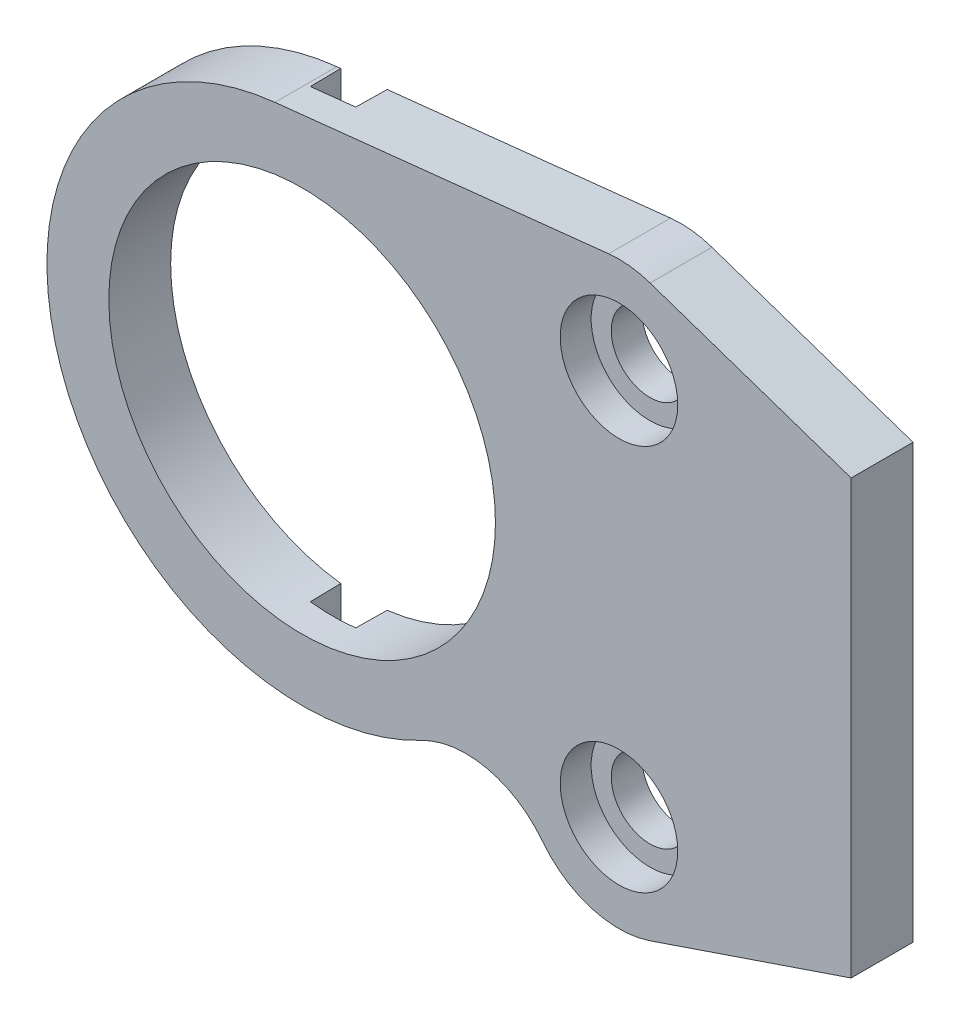
ISO-10303-21;
HEADER;
FILE_DESCRIPTION(('STEP AP214'),'2;1');
FILE_NAME('part.step','',(''),(''),'','','');
FILE_SCHEMA(('AUTOMOTIVE_DESIGN { 1 0 10303 214 1 1 1 1 }'));
ENDSEC;
DATA;
#1=APPLICATION_CONTEXT('core data for automotive mechanical design processes');
#2=APPLICATION_PROTOCOL_DEFINITION('international standard','automotive_design',2000,#1);
#3=PRODUCT_CONTEXT('',#1,'mechanical');
#4=PRODUCT('Part','Part','',(#3));
#5=PRODUCT_RELATED_PRODUCT_CATEGORY('part','',(#4));
#6=PRODUCT_DEFINITION_FORMATION('','',#4);
#7=PRODUCT_DEFINITION_CONTEXT('part definition',#1,'design');
#8=PRODUCT_DEFINITION('design','',#6,#7);
#9=PRODUCT_DEFINITION_SHAPE('','',#8);
#10=(LENGTH_UNIT() NAMED_UNIT(*) SI_UNIT(.MILLI.,.METRE.));
#11=(NAMED_UNIT(*) PLANE_ANGLE_UNIT() SI_UNIT($,.RADIAN.));
#12=(NAMED_UNIT(*) SI_UNIT($,.STERADIAN.) SOLID_ANGLE_UNIT());
#13=UNCERTAINTY_MEASURE_WITH_UNIT(LENGTH_MEASURE(1.E-05),#10,'distance_accuracy_value','');
#14=(GEOMETRIC_REPRESENTATION_CONTEXT(3) GLOBAL_UNCERTAINTY_ASSIGNED_CONTEXT((#13)) GLOBAL_UNIT_ASSIGNED_CONTEXT((#10,
#11,#12)) REPRESENTATION_CONTEXT('',''));
#15=CARTESIAN_POINT('',(0.,0.,0.));
#16=DIRECTION('',(0.,0.,1.));
#17=DIRECTION('',(1.,0.,0.));
#18=AXIS2_PLACEMENT_3D('',#15,#16,#17);
#19=CARTESIAN_POINT('',(0.,0.,0.));
#20=DIRECTION('',(0.,0.,1.));
#21=DIRECTION('',(1.,0.,0.));
#22=AXIS2_PLACEMENT_3D('',#19,#20,#21);
#23=PLANE('',#22);
#24=DIRECTION('',(0.,-1.,0.));
#25=VECTOR('',#24,1.);
#26=CARTESIAN_POINT('',(-3.,0.,0.));
#27=LINE('',#26,#25);
#28=CARTESIAN_POINT('',(-3.,-32.86335345031,0.));
#29=VERTEX_POINT('',#28);
#30=CARTESIAN_POINT('',(-3.,-24.8193472919817,0.));
#31=VERTEX_POINT('',#30);
#32=EDGE_CURVE('E162',#29,#31,#27,.F.);
#33=ORIENTED_EDGE('',*,*,#32,.F.);
#34=CARTESIAN_POINT('',(0.,0.,0.));
#35=DIRECTION('',(0.,0.,1.));
#36=DIRECTION('',(1.,0.,0.));
#37=AXIS2_PLACEMENT_3D('',#34,#35,#36);
#38=CIRCLE('',#37,33.);
#39=CARTESIAN_POINT('',(-3.50990049511811,32.8128114996928,0.));
#40=VERTEX_POINT('',#39);
#41=EDGE_CURVE('E175',#40,#29,#38,.T.);
#42=ORIENTED_EDGE('',*,*,#41,.F.);
#43=DIRECTION('',(0.994327621202811,0.106360621064185,0.));
#44=VECTOR('',#43,1.);
#45=CARTESIAN_POINT('',(-3.50990049511811,32.8128114996927,0.));
#46=LINE('',#45,#44);
#47=CARTESIAN_POINT('',(-3.,32.8673542200047,0.));
#48=VERTEX_POINT('',#47);
#49=EDGE_CURVE('E169',#40,#48,#46,.T.);
#50=ORIENTED_EDGE('',*,*,#49,.T.);
#51=CARTESIAN_POINT('',(-3.,24.8193472919817,0.));
#52=VERTEX_POINT('',#51);
#53=EDGE_CURVE('E153',#52,#48,#27,.F.);
#54=ORIENTED_EDGE('',*,*,#53,.F.);
#55=CARTESIAN_POINT('',(0.,0.,0.));
#56=DIRECTION('',(0.,0.,1.));
#57=DIRECTION('',(1.,0.,0.));
#58=AXIS2_PLACEMENT_3D('',#55,#56,#57);
#59=CIRCLE('',#58,25.);
#60=EDGE_CURVE('E216',#52,#31,#59,.T.);
#61=ORIENTED_EDGE('',*,*,#60,.T.);
#62=EDGE_LOOP('',(#33,#42,#50,#54,#61));
#63=FACE_BOUND('',#62,.T.);
#64=ADVANCED_FACE('F41',(#63),#23,.F.);
#65=CARTESIAN_POINT('',(0.,0.,8.));
#66=DIRECTION('',(0.,0.,-1.));
#67=DIRECTION('',(-1.,0.,0.));
#68=AXIS2_PLACEMENT_3D('',#65,#66,#67);
#69=CYLINDRICAL_SURFACE('',#68,33.);
#70=CARTESIAN_POINT('',(0.,0.,4.));
#71=DIRECTION('',(0.,0.,-1.));
#72=DIRECTION('',(-1.,0.,0.));
#73=AXIS2_PLACEMENT_3D('',#70,#71,#72);
#74=CIRCLE('',#73,33.);
#75=CARTESIAN_POINT('',(2.93017974028713,-32.8696523664247,4.));
#76=VERTEX_POINT('',#75);
#77=CARTESIAN_POINT('',(-2.93017974028713,-32.8696523664247,4.));
#78=VERTEX_POINT('',#77);
#79=EDGE_CURVE('E224',#76,#78,#74,.T.);
#80=ORIENTED_EDGE('',*,*,#79,.F.);
#81=CARTESIAN_POINT('',(0.,0.,171.869884892278));
#82=DIRECTION('',(0.999847695156391,0.,0.0174524064372835));
#83=DIRECTION('',(0.0174524064372835,0.,-0.999847695156391));
#84=AXIS2_PLACEMENT_3D('',#81,#82,#83);
#85=ELLIPSE('',#84,1890.85672045215,33.);
#86=CARTESIAN_POINT('',(3.,-32.86335345031,0.));
#87=VERTEX_POINT('',#86);
#88=EDGE_CURVE('E285',#76,#87,#85,.T.);
#89=ORIENTED_EDGE('',*,*,#88,.T.);
#90=CARTESIAN_POINT('',(15.3617484347177,-29.2064493738703,0.));
#91=VERTEX_POINT('',#90);
#92=EDGE_CURVE('E220',#87,#91,#38,.T.);
#93=ORIENTED_EDGE('',*,*,#92,.T.);
#94=DIRECTION('',(0.,0.,-1.));
#95=VECTOR('',#94,1.);
#96=CARTESIAN_POINT('',(15.3617484347177,-29.2064493738703,8.));
#97=LINE('',#96,#95);
#98=CARTESIAN_POINT('',(15.3617484347177,-29.2064493738703,8.));
#99=VERTEX_POINT('',#98);
#100=EDGE_CURVE('E163',#99,#91,#97,.T.);
#101=ORIENTED_EDGE('',*,*,#100,.F.);
#102=CARTESIAN_POINT('',(0.,0.,8.));
#103=DIRECTION('',(0.,0.,1.));
#104=DIRECTION('',(1.,0.,0.));
#105=AXIS2_PLACEMENT_3D('',#102,#103,#104);
#106=CIRCLE('',#105,33.);
#107=CARTESIAN_POINT('',(-3.50990049511811,32.8128114996928,8.));
#108=VERTEX_POINT('',#107);
#109=EDGE_CURVE('E180',#108,#99,#106,.T.);
#110=ORIENTED_EDGE('',*,*,#109,.F.);
#111=DIRECTION('',(0.,0.,-1.));
#112=VECTOR('',#111,1.);
#113=CARTESIAN_POINT('',(-3.50990049511811,32.8128114996928,8.));
#114=LINE('',#113,#112);
#115=EDGE_CURVE('E186',#108,#40,#114,.T.);
#116=ORIENTED_EDGE('',*,*,#115,.T.);
#117=ORIENTED_EDGE('',*,*,#41,.T.);
#118=CARTESIAN_POINT('',(0.,0.,171.869884892278));
#119=DIRECTION('',(-0.999847695156391,0.,0.0174524064372835));
#120=DIRECTION('',(-0.0174524064372835,0.,-0.999847695156391));
#121=AXIS2_PLACEMENT_3D('',#118,#119,#120);
#122=ELLIPSE('',#121,1890.85672045215,33.);
#123=EDGE_CURVE('E56',#78,#29,#122,.F.);
#124=ORIENTED_EDGE('',*,*,#123,.F.);
#125=EDGE_LOOP('',(#80,#89,#93,#101,#110,#116,#117,#124));
#126=FACE_BOUND('',#125,.T.);
#127=ADVANCED_FACE('F283',(#126),#69,.T.);
#128=CARTESIAN_POINT('',(21.1805925387774,-40.2694983791242,8.));
#129=DIRECTION('',(0.,0.,-1.));
#130=DIRECTION('',(-1.,0.,0.));
#131=AXIS2_PLACEMENT_3D('',#128,#129,#130);
#132=CYLINDRICAL_SURFACE('',#131,12.5);
#133=CARTESIAN_POINT('',(21.1805925387774,-40.2694983791242,0.));
#134=DIRECTION('',(0.,0.,1.));
#135=DIRECTION('',(1.,0.,0.));
#136=AXIS2_PLACEMENT_3D('',#133,#134,#135);
#137=CIRCLE('',#136,12.5);
#138=CARTESIAN_POINT('',(31.0780975179366,-32.6347491895621,0.));
#139=VERTEX_POINT('',#138);
#140=EDGE_CURVE('E228',#139,#91,#137,.T.);
#141=ORIENTED_EDGE('',*,*,#140,.F.);
#142=DIRECTION('',(0.,0.,-1.));
#143=VECTOR('',#142,1.);
#144=CARTESIAN_POINT('',(31.0780975179366,-32.6347491895621,8.));
#145=LINE('',#144,#143);
#146=CARTESIAN_POINT('',(31.0780975179366,-32.6347491895621,8.));
#147=VERTEX_POINT('',#146);
#148=EDGE_CURVE('E200',#147,#139,#145,.T.);
#149=ORIENTED_EDGE('',*,*,#148,.F.);
#150=CARTESIAN_POINT('',(21.1805925387774,-40.2694983791242,8.));
#151=DIRECTION('',(0.,0.,1.));
#152=DIRECTION('',(1.,0.,0.));
#153=AXIS2_PLACEMENT_3D('',#150,#151,#152);
#154=CIRCLE('',#153,12.5);
#155=EDGE_CURVE('E299',#147,#99,#154,.T.);
#156=ORIENTED_EDGE('',*,*,#155,.T.);
#157=ORIENTED_EDGE('',*,*,#100,.T.);
#158=EDGE_LOOP('',(#141,#149,#156,#157));
#159=FACE_BOUND('',#158,.T.);
#160=ADVANCED_FACE('F277',(#159),#132,.F.);
#161=CARTESIAN_POINT('',(40.9756024970958,-25.,8.));
#162=DIRECTION('',(0.,0.,-1.));
#163=DIRECTION('',(-1.,0.,0.));
#164=AXIS2_PLACEMENT_3D('',#161,#162,#163);
#165=CYLINDRICAL_SURFACE('',#164,12.5);
#166=CARTESIAN_POINT('',(40.9756024970958,-25.,0.));
#167=DIRECTION('',(0.,0.,1.));
#168=DIRECTION('',(1.,0.,0.));
#169=AXIS2_PLACEMENT_3D('',#166,#167,#168);
#170=CIRCLE('',#169,12.5);
#171=CARTESIAN_POINT('',(44.9971224384649,-36.8354289048251,0.));
#172=VERTEX_POINT('',#171);
#173=EDGE_CURVE('E231',#172,#139,#170,.F.);
#174=ORIENTED_EDGE('',*,*,#173,.F.);
#175=DIRECTION('',(0.,0.,-1.));
#176=VECTOR('',#175,1.);
#177=CARTESIAN_POINT('',(44.9971224384649,-36.8354289048251,8.));
#178=LINE('',#177,#176);
#179=CARTESIAN_POINT('',(44.9971224384649,-36.8354289048251,8.));
#180=VERTEX_POINT('',#179);
#181=EDGE_CURVE('E198',#180,#172,#178,.T.);
#182=ORIENTED_EDGE('',*,*,#181,.F.);
#183=CARTESIAN_POINT('',(40.9756024970958,-25.,8.));
#184=DIRECTION('',(0.,0.,1.));
#185=DIRECTION('',(1.,0.,0.));
#186=AXIS2_PLACEMENT_3D('',#183,#184,#185);
#187=CIRCLE('',#186,12.5);
#188=EDGE_CURVE('E273',#180,#147,#187,.F.);
#189=ORIENTED_EDGE('',*,*,#188,.T.);
#190=ORIENTED_EDGE('',*,*,#148,.T.);
#191=EDGE_LOOP('',(#174,#182,#189,#190));
#192=FACE_BOUND('',#191,.T.);
#193=ADVANCED_FACE('F271',(#192),#165,.T.);
#194=CARTESIAN_POINT('',(15.8781170003741,-46.7296762518206,8.));
#195=DIRECTION('',(0.321721595309535,-0.94683431238601,0.));
#196=DIRECTION('',(0.94683431238601,0.321721595309535,0.));
#197=AXIS2_PLACEMENT_3D('',#194,#195,#196);
#198=PLANE('',#197);
#199=DIRECTION('',(-0.94683431238601,-0.321721595309535,0.));
#200=VECTOR('',#199,1.);
#201=CARTESIAN_POINT('',(15.8781170003741,-46.7296762518206,0.));
#202=LINE('',#201,#200);
#203=CARTESIAN_POINT('',(71.,-28.,0.));
#204=VERTEX_POINT('',#203);
#205=EDGE_CURVE('E234',#204,#172,#202,.T.);
#206=ORIENTED_EDGE('',*,*,#205,.F.);
#207=DIRECTION('',(0.,0.,-1.));
#208=VECTOR('',#207,1.);
#209=CARTESIAN_POINT('',(71.,-28.,8.));
#210=LINE('',#209,#208);
#211=CARTESIAN_POINT('',(71.,-28.,8.));
#212=VERTEX_POINT('',#211);
#213=EDGE_CURVE('E196',#212,#204,#210,.T.);
#214=ORIENTED_EDGE('',*,*,#213,.F.);
#215=DIRECTION('',(-0.94683431238601,-0.321721595309535,0.));
#216=VECTOR('',#215,1.);
#217=CARTESIAN_POINT('',(15.8781170003741,-46.7296762518206,8.));
#218=LINE('',#217,#216);
#219=EDGE_CURVE('E267',#212,#180,#218,.T.);
#220=ORIENTED_EDGE('',*,*,#219,.T.);
#221=ORIENTED_EDGE('',*,*,#181,.T.);
#222=EDGE_LOOP('',(#206,#214,#220,#221));
#223=FACE_BOUND('',#222,.T.);
#224=ADVANCED_FACE('F264',(#223),#198,.T.);
#225=CARTESIAN_POINT('',(71.,0.,8.));
#226=DIRECTION('',(1.,0.,0.));
#227=DIRECTION('',(0.,1.,0.));
#228=AXIS2_PLACEMENT_3D('',#225,#226,#227);
#229=PLANE('',#228);
#230=DIRECTION('',(0.,-1.,0.));
#231=VECTOR('',#230,1.);
#232=CARTESIAN_POINT('',(71.,0.,0.));
#233=LINE('',#232,#231);
#234=CARTESIAN_POINT('',(71.,28.,0.));
#235=VERTEX_POINT('',#234);
#236=EDGE_CURVE('E237',#235,#204,#233,.T.);
#237=ORIENTED_EDGE('',*,*,#236,.F.);
#238=DIRECTION('',(0.,0.,-1.));
#239=VECTOR('',#238,1.);
#240=CARTESIAN_POINT('',(71.,28.,8.));
#241=LINE('',#240,#239);
#242=CARTESIAN_POINT('',(71.,28.,8.));
#243=VERTEX_POINT('',#242);
#244=EDGE_CURVE('E194',#243,#235,#241,.T.);
#245=ORIENTED_EDGE('',*,*,#244,.F.);
#246=DIRECTION('',(0.,-1.,0.));
#247=VECTOR('',#246,1.);
#248=CARTESIAN_POINT('',(71.,0.,8.));
#249=LINE('',#248,#247);
#250=EDGE_CURVE('E303',#243,#212,#249,.T.);
#251=ORIENTED_EDGE('',*,*,#250,.T.);
#252=ORIENTED_EDGE('',*,*,#213,.T.);
#253=EDGE_LOOP('',(#237,#245,#251,#252));
#254=FACE_BOUND('',#253,.T.);
#255=ADVANCED_FACE('F260',(#254),#229,.T.);
#256=CARTESIAN_POINT('',(15.8781170003742,46.7296762518207,8.));
#257=DIRECTION('',(0.321721595309536,0.946834312386009,0.));
#258=DIRECTION('',(-0.94683431238601,0.321721595309536,0.));
#259=AXIS2_PLACEMENT_3D('',#256,#257,#258);
#260=PLANE('',#259);
#261=DIRECTION('',(0.94683431238601,-0.321721595309536,0.));
#262=VECTOR('',#261,1.);
#263=CARTESIAN_POINT('',(15.8781170003742,46.7296762518207,0.));
#264=LINE('',#263,#262);
#265=CARTESIAN_POINT('',(44.997122438465,36.8354289048251,0.));
#266=VERTEX_POINT('',#265);
#267=EDGE_CURVE('E239',#266,#235,#264,.T.);
#268=ORIENTED_EDGE('',*,*,#267,.F.);
#269=DIRECTION('',(0.,0.,-1.));
#270=VECTOR('',#269,1.);
#271=CARTESIAN_POINT('',(44.997122438465,36.8354289048251,8.));
#272=LINE('',#271,#270);
#273=CARTESIAN_POINT('',(44.997122438465,36.8354289048251,8.));
#274=VERTEX_POINT('',#273);
#275=EDGE_CURVE('E192',#274,#266,#272,.T.);
#276=ORIENTED_EDGE('',*,*,#275,.F.);
#277=DIRECTION('',(0.94683431238601,-0.321721595309536,0.));
#278=VECTOR('',#277,1.);
#279=CARTESIAN_POINT('',(15.8781170003742,46.7296762518207,8.));
#280=LINE('',#279,#278);
#281=EDGE_CURVE('E256',#274,#243,#280,.T.);
#282=ORIENTED_EDGE('',*,*,#281,.T.);
#283=ORIENTED_EDGE('',*,*,#244,.T.);
#284=EDGE_LOOP('',(#268,#276,#282,#283));
#285=FACE_BOUND('',#284,.T.);
#286=ADVANCED_FACE('F254',(#285),#260,.T.);
#287=CARTESIAN_POINT('',(40.9756024970958,25.,8.));
#288=DIRECTION('',(0.,0.,-1.));
#289=DIRECTION('',(-1.,0.,0.));
#290=AXIS2_PLACEMENT_3D('',#287,#288,#289);
#291=CYLINDRICAL_SURFACE('',#290,12.5);
#292=CARTESIAN_POINT('',(40.9756024970958,25.,0.));
#293=DIRECTION('',(0.,0.,1.));
#294=DIRECTION('',(1.,0.,0.));
#295=AXIS2_PLACEMENT_3D('',#292,#293,#294);
#296=CIRCLE('',#295,12.5);
#297=CARTESIAN_POINT('',(39.6460947337934,37.4290952650351,0.));
#298=VERTEX_POINT('',#297);
#299=EDGE_CURVE('E182',#298,#266,#296,.F.);
#300=ORIENTED_EDGE('',*,*,#299,.F.);
#301=DIRECTION('',(0.,0.,-1.));
#302=VECTOR('',#301,1.);
#303=CARTESIAN_POINT('',(39.6460947337934,37.4290952650351,8.));
#304=LINE('',#303,#302);
#305=CARTESIAN_POINT('',(39.6460947337934,37.4290952650351,8.));
#306=VERTEX_POINT('',#305);
#307=EDGE_CURVE('E188',#306,#298,#304,.T.);
#308=ORIENTED_EDGE('',*,*,#307,.F.);
#309=CARTESIAN_POINT('',(40.9756024970958,25.,8.));
#310=DIRECTION('',(0.,0.,1.));
#311=DIRECTION('',(1.,0.,0.));
#312=AXIS2_PLACEMENT_3D('',#309,#310,#311);
#313=CIRCLE('',#312,12.5);
#314=EDGE_CURVE('E250',#306,#274,#313,.F.);
#315=ORIENTED_EDGE('',*,*,#314,.T.);
#316=ORIENTED_EDGE('',*,*,#275,.T.);
#317=EDGE_LOOP('',(#300,#308,#315,#316));
#318=FACE_BOUND('',#317,.T.);
#319=ADVANCED_FACE('F247',(#318),#291,.T.);
#320=CARTESIAN_POINT('',(0.,0.,8.));
#321=DIRECTION('',(0.,0.,-1.));
#322=DIRECTION('',(-1.,0.,0.));
#323=AXIS2_PLACEMENT_3D('',#320,#321,#322);
#324=CYLINDRICAL_SURFACE('',#323,25.);
#325=CARTESIAN_POINT('',(0.,0.,171.869884892278));
#326=DIRECTION('',(0.999847695156391,0.,0.0174524064372835));
#327=DIRECTION('',(0.0174524064372835,0.,-0.999847695156391));
#328=AXIS2_PLACEMENT_3D('',#325,#326,#327);
#329=ELLIPSE('',#328,1432.46721246375,25.);
#330=CARTESIAN_POINT('',(3.,24.8193472919817,0.));
#331=VERTEX_POINT('',#330);
#332=CARTESIAN_POINT('',(2.93017974028713,24.8276870990757,4.));
#333=VERTEX_POINT('',#332);
#334=EDGE_CURVE('E289',#331,#333,#329,.T.);
#335=ORIENTED_EDGE('',*,*,#334,.F.);
#336=CARTESIAN_POINT('',(3.,-24.8193472919817,0.));
#337=VERTEX_POINT('',#336);
#338=EDGE_CURVE('E221',#337,#331,#59,.T.);
#339=ORIENTED_EDGE('',*,*,#338,.F.);
#340=CARTESIAN_POINT('',(2.93017974028713,-24.8276870990757,4.));
#341=VERTEX_POINT('',#340);
#342=EDGE_CURVE('E293',#341,#337,#329,.T.);
#343=ORIENTED_EDGE('',*,*,#342,.F.);
#344=CARTESIAN_POINT('',(0.,0.,4.));
#345=DIRECTION('',(0.,0.,-1.));
#346=DIRECTION('',(-1.,0.,0.));
#347=AXIS2_PLACEMENT_3D('',#344,#345,#346);
#348=CIRCLE('',#347,25.);
#349=CARTESIAN_POINT('',(-2.93017974028713,-24.8276870990757,4.));
#350=VERTEX_POINT('',#349);
#351=EDGE_CURVE('E218',#341,#350,#348,.T.);
#352=ORIENTED_EDGE('',*,*,#351,.T.);
#353=CARTESIAN_POINT('',(0.,0.,171.869884892278));
#354=DIRECTION('',(-0.999847695156391,0.,0.0174524064372835));
#355=DIRECTION('',(-0.0174524064372835,0.,-0.999847695156391));
#356=AXIS2_PLACEMENT_3D('',#353,#354,#355);
#357=ELLIPSE('',#356,1432.46721246375,25.);
#358=EDGE_CURVE('E170',#350,#31,#357,.F.);
#359=ORIENTED_EDGE('',*,*,#358,.T.);
#360=ORIENTED_EDGE('',*,*,#60,.F.);
#361=CARTESIAN_POINT('',(-2.93017974028713,24.8276870990757,4.));
#362=VERTEX_POINT('',#361);
#363=EDGE_CURVE('E64',#52,#362,#357,.F.);
#364=ORIENTED_EDGE('',*,*,#363,.T.);
#365=EDGE_CURVE('E291',#362,#333,#348,.T.);
#366=ORIENTED_EDGE('',*,*,#365,.T.);
#367=EDGE_LOOP('',(#335,#339,#343,#352,#359,#360,#364,#366));
#368=FACE_BOUND('',#367,.T.);
#369=CARTESIAN_POINT('',(0.,0.,8.));
#370=DIRECTION('',(0.,0.,1.));
#371=DIRECTION('',(1.,0.,0.));
#372=AXIS2_PLACEMENT_3D('',#369,#370,#371);
#373=CIRCLE('',#372,25.);
#374=CARTESIAN_POINT('',(25.,0.,8.));
#375=VERTEX_POINT('',#374);
#376=EDGE_CURVE('E176',#375,#375,#373,.T.);
#377=ORIENTED_EDGE('',*,*,#376,.T.);
#378=EDGE_LOOP('',(#377));
#379=FACE_BOUND('',#378,.T.);
#380=ADVANCED_FACE('F43',(#368,#379),#324,.F.);
#381=CARTESIAN_POINT('',(-3.50990049511811,32.8128114996927,8.));
#382=DIRECTION('',(-0.106360621064185,0.994327621202811,0.));
#383=DIRECTION('',(-0.994327621202811,-0.106360621064185,0.));
#384=AXIS2_PLACEMENT_3D('',#381,#382,#383);
#385=PLANE('',#384);
#386=DIRECTION('',(0.0174523760258042,0.00186683494812784,-0.999845952883908));
#387=VECTOR('',#386,1.);
#388=CARTESIAN_POINT('',(2.85839699138778,33.4940116004874,8.11243093019407));
#389=LINE('',#388,#387);
#390=CARTESIAN_POINT('',(2.93017974028713,33.5016900131069,4.));
#391=VERTEX_POINT('',#390);
#392=CARTESIAN_POINT('',(3.,33.5091585033989,0.));
#393=VERTEX_POINT('',#392);
#394=EDGE_CURVE('E309',#391,#393,#389,.T.);
#395=ORIENTED_EDGE('',*,*,#394,.F.);
#396=DIRECTION('',(-0.994327621202811,-0.106360621064185,0.));
#397=VECTOR('',#396,1.);
#398=CARTESIAN_POINT('',(-3.50990049511811,32.8128114996927,4.));
#399=LINE('',#398,#397);
#400=CARTESIAN_POINT('',(-2.93017974028713,32.8748227102966,4.));
#401=VERTEX_POINT('',#400);
#402=EDGE_CURVE('E11',#391,#401,#399,.T.);
#403=ORIENTED_EDGE('',*,*,#402,.T.);
#404=DIRECTION('',(0.0174523760258042,0.00186683494812784,0.999845952883908));
#405=VECTOR('',#404,1.);
#406=CARTESIAN_POINT('',(-2.86055958500046,32.8822697959422,7.98853602510054));
#407=LINE('',#406,#405);
#408=EDGE_CURVE('E156',#401,#48,#407,.F.);
#409=ORIENTED_EDGE('',*,*,#408,.T.);
#410=ORIENTED_EDGE('',*,*,#49,.F.);
#411=ORIENTED_EDGE('',*,*,#115,.F.);
#412=DIRECTION('',(0.994327621202811,0.106360621064185,0.));
#413=VECTOR('',#412,1.);
#414=CARTESIAN_POINT('',(-3.50990049511811,32.8128114996927,8.));
#415=LINE('',#414,#413);
#416=EDGE_CURVE('E189',#108,#306,#415,.T.);
#417=ORIENTED_EDGE('',*,*,#416,.T.);
#418=ORIENTED_EDGE('',*,*,#307,.T.);
#419=EDGE_CURVE('E177',#393,#298,#46,.T.);
#420=ORIENTED_EDGE('',*,*,#419,.F.);
#421=EDGE_LOOP('',(#395,#403,#409,#410,#411,#417,#418,#420));
#422=FACE_BOUND('',#421,.T.);
#423=ADVANCED_FACE('F168',(#422),#385,.T.);
#424=CARTESIAN_POINT('',(0.,0.,8.));
#425=DIRECTION('',(0.,0.,1.));
#426=DIRECTION('',(1.,0.,0.));
#427=AXIS2_PLACEMENT_3D('',#424,#425,#426);
#428=PLANE('',#427);
#429=CARTESIAN_POINT('',(40.9756024970958,25.,8.));
#430=DIRECTION('',(0.,0.,1.));
#431=DIRECTION('',(1.,0.,0.));
#432=AXIS2_PLACEMENT_3D('',#429,#430,#431);
#433=CIRCLE('',#432,7.60000000000001);
#434=CARTESIAN_POINT('',(48.5756024970958,25.,8.));
#435=VERTEX_POINT('',#434);
#436=EDGE_CURVE('E338',#435,#435,#433,.T.);
#437=ORIENTED_EDGE('',*,*,#436,.F.);
#438=EDGE_LOOP('',(#437));
#439=FACE_BOUND('',#438,.T.);
#440=CARTESIAN_POINT('',(40.9756024970958,-25.,8.));
#441=DIRECTION('',(0.,0.,1.));
#442=DIRECTION('',(1.,0.,0.));
#443=AXIS2_PLACEMENT_3D('',#440,#441,#442);
#444=CIRCLE('',#443,7.60000000000001);
#445=CARTESIAN_POINT('',(48.5756024970958,-25.,8.));
#446=VERTEX_POINT('',#445);
#447=EDGE_CURVE('E326',#446,#446,#444,.T.);
#448=ORIENTED_EDGE('',*,*,#447,.F.);
#449=EDGE_LOOP('',(#448));
#450=FACE_BOUND('',#449,.T.);
#451=ORIENTED_EDGE('',*,*,#376,.F.);
#452=EDGE_LOOP('',(#451));
#453=FACE_BOUND('',#452,.T.);
#454=ORIENTED_EDGE('',*,*,#109,.T.);
#455=ORIENTED_EDGE('',*,*,#155,.F.);
#456=ORIENTED_EDGE('',*,*,#188,.F.);
#457=ORIENTED_EDGE('',*,*,#219,.F.);
#458=ORIENTED_EDGE('',*,*,#250,.F.);
#459=ORIENTED_EDGE('',*,*,#281,.F.);
#460=ORIENTED_EDGE('',*,*,#314,.F.);
#461=ORIENTED_EDGE('',*,*,#416,.F.);
#462=EDGE_LOOP('',(#454,#455,#456,#457,#458,#459,#460,#461));
#463=FACE_BOUND('',#462,.T.);
#464=ADVANCED_FACE('F308',(#439,#450,#453,#463),#428,.T.);
#465=CARTESIAN_POINT('',(40.9756024970958,25.,0.));
#466=DIRECTION('',(0.,0.,1.));
#467=DIRECTION('',(1.,0.,0.));
#468=AXIS2_PLACEMENT_3D('',#465,#466,#467);
#469=CIRCLE('',#468,5.00000000000001);
#470=CARTESIAN_POINT('',(45.9756024970958,25.,0.));
#471=VERTEX_POINT('',#470);
#472=EDGE_CURVE('E329',#471,#471,#469,.T.);
#473=ORIENTED_EDGE('',*,*,#472,.T.);
#474=EDGE_LOOP('',(#473));
#475=FACE_BOUND('',#474,.T.);
#476=CARTESIAN_POINT('',(40.9756024970958,-25.,0.));
#477=DIRECTION('',(0.,0.,1.));
#478=DIRECTION('',(1.,0.,0.));
#479=AXIS2_PLACEMENT_3D('',#476,#477,#478);
#480=CIRCLE('',#479,5.00000000000001);
#481=CARTESIAN_POINT('',(45.9756024970958,-25.,0.));
#482=VERTEX_POINT('',#481);
#483=EDGE_CURVE('E317',#482,#482,#480,.T.);
#484=ORIENTED_EDGE('',*,*,#483,.T.);
#485=EDGE_LOOP('',(#484));
#486=FACE_BOUND('',#485,.T.);
#487=ORIENTED_EDGE('',*,*,#92,.F.);
#488=DIRECTION('',(0.,1.,0.));
#489=VECTOR('',#488,1.);
#490=CARTESIAN_POINT('',(3.,0.,0.));
#491=LINE('',#490,#489);
#492=EDGE_CURVE('E49',#87,#337,#491,.T.);
#493=ORIENTED_EDGE('',*,*,#492,.T.);
#494=ORIENTED_EDGE('',*,*,#338,.T.);
#495=EDGE_CURVE('E203',#331,#393,#491,.T.);
#496=ORIENTED_EDGE('',*,*,#495,.T.);
#497=ORIENTED_EDGE('',*,*,#419,.T.);
#498=ORIENTED_EDGE('',*,*,#299,.T.);
#499=ORIENTED_EDGE('',*,*,#267,.T.);
#500=ORIENTED_EDGE('',*,*,#236,.T.);
#501=ORIENTED_EDGE('',*,*,#205,.T.);
#502=ORIENTED_EDGE('',*,*,#173,.T.);
#503=ORIENTED_EDGE('',*,*,#140,.T.);
#504=EDGE_LOOP('',(#487,#493,#494,#496,#497,#498,#499,#500,#501,#502,#503));
#505=FACE_BOUND('',#504,.T.);
#506=ADVANCED_FACE('F245',(#475,#486,#505),#23,.F.);
#507=CARTESIAN_POINT('',(3.,36.9432849564473,0.));
#508=DIRECTION('',(0.999847695156391,0.,0.0174524064372835));
#509=DIRECTION('',(0.0174524064372835,0.,-0.999847695156391));
#510=AXIS2_PLACEMENT_3D('',#507,#508,#509);
#511=PLANE('',#510);
#512=ORIENTED_EDGE('',*,*,#334,.T.);
#513=DIRECTION('',(0.,-1.,0.));
#514=VECTOR('',#513,1.);
#515=CARTESIAN_POINT('',(2.93017974028713,0.,4.));
#516=LINE('',#515,#514);
#517=EDGE_CURVE('E314',#391,#333,#516,.T.);
#518=ORIENTED_EDGE('',*,*,#517,.F.);
#519=ORIENTED_EDGE('',*,*,#394,.T.);
#520=ORIENTED_EDGE('',*,*,#495,.F.);
#521=EDGE_LOOP('',(#512,#518,#519,#520));
#522=FACE_BOUND('',#521,.T.);
#523=ADVANCED_FACE('F363',(#522),#511,.F.);
#524=CARTESIAN_POINT('',(-3.,36.9432849564473,0.));
#525=DIRECTION('',(-0.999847695156391,0.,0.0174524064372835));
#526=DIRECTION('',(0.0174524064372835,0.,0.999847695156391));
#527=AXIS2_PLACEMENT_3D('',#524,#525,#526);
#528=PLANE('',#527);
#529=ORIENTED_EDGE('',*,*,#53,.T.);
#530=ORIENTED_EDGE('',*,*,#408,.F.);
#531=DIRECTION('',(0.,1.,0.));
#532=VECTOR('',#531,1.);
#533=CARTESIAN_POINT('',(-2.93017974028713,0.,4.));
#534=LINE('',#533,#532);
#535=EDGE_CURVE('E171',#401,#362,#534,.F.);
#536=ORIENTED_EDGE('',*,*,#535,.T.);
#537=ORIENTED_EDGE('',*,*,#363,.F.);
#538=EDGE_LOOP('',(#529,#530,#536,#537));
#539=FACE_BOUND('',#538,.T.);
#540=ADVANCED_FACE('F155',(#539),#528,.F.);
#541=CARTESIAN_POINT('',(0.,0.,4.));
#542=DIRECTION('',(0.,0.,-1.));
#543=DIRECTION('',(-1.,0.,0.));
#544=AXIS2_PLACEMENT_3D('',#541,#542,#543);
#545=PLANE('',#544);
#546=ORIENTED_EDGE('',*,*,#535,.F.);
#547=ORIENTED_EDGE('',*,*,#402,.F.);
#548=ORIENTED_EDGE('',*,*,#517,.T.);
#549=ORIENTED_EDGE('',*,*,#365,.F.);
#550=EDGE_LOOP('',(#546,#547,#548,#549));
#551=FACE_BOUND('',#550,.T.);
#552=ADVANCED_FACE('F402',(#551),#545,.T.);
#553=ORIENTED_EDGE('',*,*,#79,.T.);
#554=EDGE_CURVE('E312',#350,#78,#534,.F.);
#555=ORIENTED_EDGE('',*,*,#554,.F.);
#556=ORIENTED_EDGE('',*,*,#351,.F.);
#557=EDGE_CURVE('E315',#341,#76,#516,.T.);
#558=ORIENTED_EDGE('',*,*,#557,.T.);
#559=EDGE_LOOP('',(#553,#555,#556,#558));
#560=FACE_BOUND('',#559,.T.);
#561=ADVANCED_FACE('F400',(#560),#545,.T.);
#562=ORIENTED_EDGE('',*,*,#557,.F.);
#563=ORIENTED_EDGE('',*,*,#342,.T.);
#564=ORIENTED_EDGE('',*,*,#492,.F.);
#565=ORIENTED_EDGE('',*,*,#88,.F.);
#566=EDGE_LOOP('',(#562,#563,#564,#565));
#567=FACE_BOUND('',#566,.T.);
#568=ADVANCED_FACE('F371',(#567),#511,.F.);
#569=ORIENTED_EDGE('',*,*,#123,.T.);
#570=ORIENTED_EDGE('',*,*,#32,.T.);
#571=ORIENTED_EDGE('',*,*,#358,.F.);
#572=ORIENTED_EDGE('',*,*,#554,.T.);
#573=EDGE_LOOP('',(#569,#570,#571,#572));
#574=FACE_BOUND('',#573,.T.);
#575=ADVANCED_FACE('F210',(#574),#528,.F.);
#576=CARTESIAN_POINT('',(40.9756024970958,-25.,8.));
#577=DIRECTION('',(0.,0.,1.));
#578=DIRECTION('',(1.,0.,0.));
#579=AXIS2_PLACEMENT_3D('',#576,#577,#578);
#580=CYLINDRICAL_SURFACE('',#579,5.00000000000001);
#581=ORIENTED_EDGE('',*,*,#483,.F.);
#582=EDGE_LOOP('',(#581));
#583=FACE_BOUND('',#582,.T.);
#584=CARTESIAN_POINT('',(40.9756024970958,-25.,4.));
#585=DIRECTION('',(0.,0.,1.));
#586=DIRECTION('',(1.,0.,0.));
#587=AXIS2_PLACEMENT_3D('',#584,#585,#586);
#588=CIRCLE('',#587,5.00000000000001);
#589=CARTESIAN_POINT('',(45.9756024970958,-25.,4.));
#590=VERTEX_POINT('',#589);
#591=EDGE_CURVE('E320',#590,#590,#588,.T.);
#592=ORIENTED_EDGE('',*,*,#591,.T.);
#593=EDGE_LOOP('',(#592));
#594=FACE_BOUND('',#593,.T.);
#595=ADVANCED_FACE('F376',(#583,#594),#580,.F.);
#596=CARTESIAN_POINT('',(45.9756024970958,-25.,4.));
#597=DIRECTION('',(0.,0.,-1.));
#598=DIRECTION('',(-1.,0.,0.));
#599=AXIS2_PLACEMENT_3D('',#596,#597,#598);
#600=PLANE('',#599);
#601=ORIENTED_EDGE('',*,*,#591,.F.);
#602=EDGE_LOOP('',(#601));
#603=FACE_BOUND('',#602,.T.);
#604=CARTESIAN_POINT('',(40.9756024970958,-25.,4.));
#605=DIRECTION('',(0.,0.,1.));
#606=DIRECTION('',(1.,0.,0.));
#607=AXIS2_PLACEMENT_3D('',#604,#605,#606);
#608=CIRCLE('',#607,7.60000000000002);
#609=CARTESIAN_POINT('',(48.5756024970958,-25.,4.));
#610=VERTEX_POINT('',#609);
#611=EDGE_CURVE('E323',#610,#610,#608,.T.);
#612=ORIENTED_EDGE('',*,*,#611,.T.);
#613=EDGE_LOOP('',(#612));
#614=FACE_BOUND('',#613,.T.);
#615=ADVANCED_FACE('F378',(#603,#614),#600,.F.);
#616=CARTESIAN_POINT('',(40.9756024970958,-25.,8.));
#617=DIRECTION('',(0.,0.,1.));
#618=DIRECTION('',(1.,0.,0.));
#619=AXIS2_PLACEMENT_3D('',#616,#617,#618);
#620=CYLINDRICAL_SURFACE('',#619,7.60000000000001);
#621=ORIENTED_EDGE('',*,*,#611,.F.);
#622=EDGE_LOOP('',(#621));
#623=FACE_BOUND('',#622,.T.);
#624=ORIENTED_EDGE('',*,*,#447,.T.);
#625=EDGE_LOOP('',(#624));
#626=FACE_BOUND('',#625,.T.);
#627=ADVANCED_FACE('F384',(#623,#626),#620,.F.);
#628=CARTESIAN_POINT('',(40.9756024970958,25.,8.));
#629=DIRECTION('',(0.,0.,1.));
#630=DIRECTION('',(1.,0.,0.));
#631=AXIS2_PLACEMENT_3D('',#628,#629,#630);
#632=CYLINDRICAL_SURFACE('',#631,5.00000000000001);
#633=ORIENTED_EDGE('',*,*,#472,.F.);
#634=EDGE_LOOP('',(#633));
#635=FACE_BOUND('',#634,.T.);
#636=CARTESIAN_POINT('',(40.9756024970958,25.,4.));
#637=DIRECTION('',(0.,0.,1.));
#638=DIRECTION('',(1.,0.,0.));
#639=AXIS2_PLACEMENT_3D('',#636,#637,#638);
#640=CIRCLE('',#639,5.00000000000001);
#641=CARTESIAN_POINT('',(45.9756024970958,25.,4.));
#642=VERTEX_POINT('',#641);
#643=EDGE_CURVE('E332',#642,#642,#640,.T.);
#644=ORIENTED_EDGE('',*,*,#643,.T.);
#645=EDGE_LOOP('',(#644));
#646=FACE_BOUND('',#645,.T.);
#647=ADVANCED_FACE('F390',(#635,#646),#632,.F.);
#648=CARTESIAN_POINT('',(45.9756024970958,25.,4.));
#649=DIRECTION('',(0.,0.,-1.));
#650=DIRECTION('',(-1.,0.,0.));
#651=AXIS2_PLACEMENT_3D('',#648,#649,#650);
#652=PLANE('',#651);
#653=ORIENTED_EDGE('',*,*,#643,.F.);
#654=EDGE_LOOP('',(#653));
#655=FACE_BOUND('',#654,.T.);
#656=CARTESIAN_POINT('',(40.9756024970958,25.,4.));
#657=DIRECTION('',(0.,0.,1.));
#658=DIRECTION('',(1.,0.,0.));
#659=AXIS2_PLACEMENT_3D('',#656,#657,#658);
#660=CIRCLE('',#659,7.60000000000002);
#661=CARTESIAN_POINT('',(48.5756024970958,25.,4.));
#662=VERTEX_POINT('',#661);
#663=EDGE_CURVE('E335',#662,#662,#660,.T.);
#664=ORIENTED_EDGE('',*,*,#663,.T.);
#665=EDGE_LOOP('',(#664));
#666=FACE_BOUND('',#665,.T.);
#667=ADVANCED_FACE('F395',(#655,#666),#652,.F.);
#668=CARTESIAN_POINT('',(40.9756024970958,25.,8.));
#669=DIRECTION('',(0.,0.,1.));
#670=DIRECTION('',(1.,0.,0.));
#671=AXIS2_PLACEMENT_3D('',#668,#669,#670);
#672=CYLINDRICAL_SURFACE('',#671,7.60000000000001);
#673=ORIENTED_EDGE('',*,*,#663,.F.);
#674=EDGE_LOOP('',(#673));
#675=FACE_BOUND('',#674,.T.);
#676=ORIENTED_EDGE('',*,*,#436,.T.);
#677=EDGE_LOOP('',(#676));
#678=FACE_BOUND('',#677,.T.);
#679=ADVANCED_FACE('F342',(#675,#678),#672,.F.);
#680=CLOSED_SHELL('',(#64,#127,#160,#193,#224,#255,#286,#319,#380,#423,#464,#506,#523,#540,#552,
#561,#568,#575,#595,#615,#627,#647,#667,#679));
#681=MANIFOLD_SOLID_BREP('B2',#680);
#682=ADVANCED_BREP_SHAPE_REPRESENTATION('',(#18,#681),#14);
#683=SHAPE_DEFINITION_REPRESENTATION(#9,#682);
ENDSEC;
END-ISO-10303-21;
